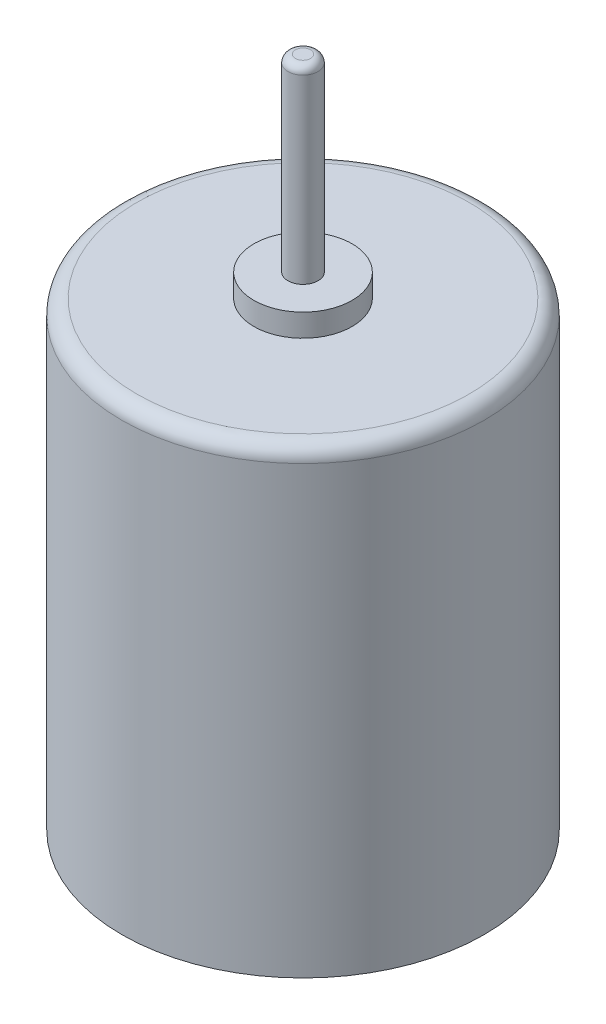
ISO-10303-21;
HEADER;
FILE_DESCRIPTION(('STEP AP214'),'2;1');
FILE_NAME('part.step','',(''),(''),'','','');
FILE_SCHEMA(('AUTOMOTIVE_DESIGN { 1 0 10303 214 1 1 1 1 }'));
ENDSEC;
DATA;
#1=APPLICATION_CONTEXT('core data for automotive mechanical design processes');
#2=APPLICATION_PROTOCOL_DEFINITION('international standard','automotive_design',2000,#1);
#3=PRODUCT_CONTEXT('',#1,'mechanical');
#4=PRODUCT('Part','Part','',(#3));
#5=PRODUCT_RELATED_PRODUCT_CATEGORY('part','',(#4));
#6=PRODUCT_DEFINITION_FORMATION('','',#4);
#7=PRODUCT_DEFINITION_CONTEXT('part definition',#1,'design');
#8=PRODUCT_DEFINITION('design','',#6,#7);
#9=PRODUCT_DEFINITION_SHAPE('','',#8);
#10=(LENGTH_UNIT() NAMED_UNIT(*) SI_UNIT(.MILLI.,.METRE.));
#11=(NAMED_UNIT(*) PLANE_ANGLE_UNIT() SI_UNIT($,.RADIAN.));
#12=(NAMED_UNIT(*) SI_UNIT($,.STERADIAN.) SOLID_ANGLE_UNIT());
#13=UNCERTAINTY_MEASURE_WITH_UNIT(LENGTH_MEASURE(1.E-05),#10,'distance_accuracy_value','');
#14=(GEOMETRIC_REPRESENTATION_CONTEXT(3) GLOBAL_UNCERTAINTY_ASSIGNED_CONTEXT((#13)) GLOBAL_UNIT_ASSIGNED_CONTEXT((#10,
#11,#12)) REPRESENTATION_CONTEXT('',''));
#15=CARTESIAN_POINT('',(0.,0.,0.));
#16=DIRECTION('',(0.,0.,1.));
#17=DIRECTION('',(1.,0.,0.));
#18=AXIS2_PLACEMENT_3D('',#15,#16,#17);
#19=CARTESIAN_POINT('',(-13.1051006987232,30.5,-2.50285866633565));
#20=DIRECTION('',(0.,-1.,0.));
#21=DIRECTION('',(0.,0.,-1.));
#22=AXIS2_PLACEMENT_3D('',#19,#20,#21);
#23=CYLINDRICAL_SURFACE('',#22,12.);
#24=CARTESIAN_POINT('',(-13.1051006987232,29.5,-2.50285866633565));
#25=DIRECTION('',(0.,1.,0.));
#26=DIRECTION('',(0.,0.,1.));
#27=AXIS2_PLACEMENT_3D('',#24,#25,#26);
#28=CIRCLE('',#27,12.);
#29=CARTESIAN_POINT('',(-13.1051006987232,29.5,-14.5028586663357));
#30=VERTEX_POINT('',#29);
#31=EDGE_CURVE('E10',#30,#30,#28,.F.);
#32=CARTESIAN_POINT('',(-13.1051006987232,0.,-2.50285866633565));
#33=DIRECTION('',(0.,1.,0.));
#34=DIRECTION('',(0.,0.,1.));
#35=AXIS2_PLACEMENT_3D('',#32,#33,#34);
#36=CIRCLE('',#35,12.);
#37=CARTESIAN_POINT('',(-13.1051006987232,0.,-14.5028586663357));
#38=VERTEX_POINT('',#37);
#39=EDGE_CURVE('E56',#38,#38,#36,.T.);
#40=CARTESIAN_POINT('',(-13.1051006987232,29.5,-14.5028586663357));
#41=CARTESIAN_POINT('',(-13.1051006987232,29.1927083333333,-14.5028586663357));
#42=CARTESIAN_POINT('',(-13.1051006987232,28.8854166666667,-14.5028586663357));
#43=CARTESIAN_POINT('',(-13.1051006987232,28.2708333333333,-14.5028586663357));
#44=CARTESIAN_POINT('',(-13.1051006987232,27.9635416666667,-14.5028586663357));
#45=CARTESIAN_POINT('',(-13.1051006987232,27.3489583333333,-14.5028586663357));
#46=CARTESIAN_POINT('',(-13.1051006987232,27.0416666666667,-14.5028586663357));
#47=CARTESIAN_POINT('',(-13.1051006987232,26.4270833333333,-14.5028586663357));
#48=CARTESIAN_POINT('',(-13.1051006987232,26.1197916666667,-14.5028586663357));
#49=CARTESIAN_POINT('',(-13.1051006987232,25.5052083333333,-14.5028586663357));
#50=CARTESIAN_POINT('',(-13.1051006987232,25.1979166666667,-14.5028586663357));
#51=CARTESIAN_POINT('',(-13.1051006987232,24.5833333333333,-14.5028586663357));
#52=CARTESIAN_POINT('',(-13.1051006987232,24.2760416666667,-14.5028586663357));
#53=CARTESIAN_POINT('',(-13.1051006987232,23.6614583333333,-14.5028586663357));
#54=CARTESIAN_POINT('',(-13.1051006987232,23.3541666666667,-14.5028586663357));
#55=CARTESIAN_POINT('',(-13.1051006987232,22.7395833333333,-14.5028586663357));
#56=CARTESIAN_POINT('',(-13.1051006987232,22.4322916666667,-14.5028586663357));
#57=CARTESIAN_POINT('',(-13.1051006987232,21.8177083333333,-14.5028586663357));
#58=CARTESIAN_POINT('',(-13.1051006987232,21.5104166666667,-14.5028586663357));
#59=CARTESIAN_POINT('',(-13.1051006987232,20.8958333333333,-14.5028586663357));
#60=CARTESIAN_POINT('',(-13.1051006987232,20.5885416666667,-14.5028586663357));
#61=CARTESIAN_POINT('',(-13.1051006987232,19.9739583333333,-14.5028586663357));
#62=CARTESIAN_POINT('',(-13.1051006987232,19.6666666666667,-14.5028586663357));
#63=CARTESIAN_POINT('',(-13.1051006987232,19.0520833333333,-14.5028586663357));
#64=CARTESIAN_POINT('',(-13.1051006987232,18.7447916666667,-14.5028586663357));
#65=CARTESIAN_POINT('',(-13.1051006987232,18.1302083333333,-14.5028586663357));
#66=CARTESIAN_POINT('',(-13.1051006987232,17.8229166666667,-14.5028586663357));
#67=CARTESIAN_POINT('',(-13.1051006987232,17.2083333333333,-14.5028586663357));
#68=CARTESIAN_POINT('',(-13.1051006987232,16.9010416666667,-14.5028586663357));
#69=CARTESIAN_POINT('',(-13.1051006987232,16.2864583333333,-14.5028586663357));
#70=CARTESIAN_POINT('',(-13.1051006987232,15.9791666666667,-14.5028586663357));
#71=CARTESIAN_POINT('',(-13.1051006987232,15.3645833333333,-14.5028586663357));
#72=CARTESIAN_POINT('',(-13.1051006987232,15.0572916666667,-14.5028586663357));
#73=CARTESIAN_POINT('',(-13.1051006987232,14.4427083333333,-14.5028586663357));
#74=CARTESIAN_POINT('',(-13.1051006987232,14.1354166666667,-14.5028586663357));
#75=CARTESIAN_POINT('',(-13.1051006987232,13.5208333333333,-14.5028586663357));
#76=CARTESIAN_POINT('',(-13.1051006987232,13.2135416666667,-14.5028586663357));
#77=CARTESIAN_POINT('',(-13.1051006987232,12.5989583333333,-14.5028586663357));
#78=CARTESIAN_POINT('',(-13.1051006987232,12.2916666666667,-14.5028586663357));
#79=CARTESIAN_POINT('',(-13.1051006987232,11.6770833333333,-14.5028586663357));
#80=CARTESIAN_POINT('',(-13.1051006987232,11.3697916666667,-14.5028586663357));
#81=CARTESIAN_POINT('',(-13.1051006987232,10.7552083333333,-14.5028586663357));
#82=CARTESIAN_POINT('',(-13.1051006987232,10.4479166666667,-14.5028586663357));
#83=CARTESIAN_POINT('',(-13.1051006987232,9.83333333333333,-14.5028586663357));
#84=CARTESIAN_POINT('',(-13.1051006987232,9.52604166666666,-14.5028586663357));
#85=CARTESIAN_POINT('',(-13.1051006987232,8.91145833333333,-14.5028586663357));
#86=CARTESIAN_POINT('',(-13.1051006987232,8.60416666666666,-14.5028586663357));
#87=CARTESIAN_POINT('',(-13.1051006987232,7.98958333333333,-14.5028586663357));
#88=CARTESIAN_POINT('',(-13.1051006987232,7.68229166666666,-14.5028586663357));
#89=CARTESIAN_POINT('',(-13.1051006987232,7.06770833333333,-14.5028586663357));
#90=CARTESIAN_POINT('',(-13.1051006987232,6.76041666666666,-14.5028586663357));
#91=CARTESIAN_POINT('',(-13.1051006987232,6.14583333333333,-14.5028586663357));
#92=CARTESIAN_POINT('',(-13.1051006987232,5.83854166666666,-14.5028586663357));
#93=CARTESIAN_POINT('',(-13.1051006987232,5.22395833333333,-14.5028586663357));
#94=CARTESIAN_POINT('',(-13.1051006987232,4.91666666666666,-14.5028586663357));
#95=CARTESIAN_POINT('',(-13.1051006987232,4.30208333333333,-14.5028586663357));
#96=CARTESIAN_POINT('',(-13.1051006987232,3.99479166666666,-14.5028586663357));
#97=CARTESIAN_POINT('',(-13.1051006987232,3.38020833333333,-14.5028586663357));
#98=CARTESIAN_POINT('',(-13.1051006987232,3.07291666666666,-14.5028586663357));
#99=CARTESIAN_POINT('',(-13.1051006987232,2.45833333333333,-14.5028586663357));
#100=CARTESIAN_POINT('',(-13.1051006987232,2.15104166666666,-14.5028586663357));
#101=CARTESIAN_POINT('',(-13.1051006987232,1.53645833333333,-14.5028586663357));
#102=CARTESIAN_POINT('',(-13.1051006987232,1.22916666666666,-14.5028586663357));
#103=CARTESIAN_POINT('',(-13.1051006987232,0.614583333333329,-14.5028586663357));
#104=CARTESIAN_POINT('',(-13.1051006987232,0.307291666666663,-14.5028586663357));
#105=CARTESIAN_POINT('',(-13.1051006987232,0.,-14.5028586663357));
#106=B_SPLINE_CURVE_WITH_KNOTS('',3,(#40,#41,#42,#43,#44,#45,#46,#47,#48,#49,#50,#51,#52,#53,
#54,#55,#56,#57,#58,#59,#60,#61,#62,#63,#64,#65,#66,#67,#68,#69,#70,#71,#72,#73,#74,#75,#76,#77,
#78,#79,#80,#81,#82,#83,#84,#85,#86,#87,#88,#89,#90,#91,#92,#93,#94,#95,#96,#97,#98,#99,#100,
#101,#102,#103,#104,#105),.UNSPECIFIED.,.F.,.F.,(4,2,2,2,2,2,2,2,2,2,2,2,2,2,2,2,2,2,2,2,2,2,2,
2,2,2,2,2,2,2,2,2,4),(0.,0.921874999999999,1.84375,2.765625,3.6875,4.609375,5.53125,6.453125,
7.375,8.296875,9.21875,10.140625,11.0625,11.984375,12.90625,13.828125,14.75,15.671875,16.59375,
17.515625,18.4375,19.359375,20.28125,21.203125,22.125,23.046875,23.96875,24.890625,25.8125,
26.734375,27.65625,28.578125,29.5),.UNSPECIFIED.);
#107=EDGE_CURVE('BSEAM36',#30,#38,#106,.T.);
#108=ORIENTED_EDGE('',*,*,#31,.T.);
#109=ORIENTED_EDGE('',*,*,#39,.T.);
#110=ORIENTED_EDGE('',*,*,#107,.T.);
#111=ORIENTED_EDGE('',*,*,#107,.F.);
#112=EDGE_LOOP('',(#108,#110,#109,#111));
#113=FACE_BOUND('',#112,.T.);
#114=ADVANCED_FACE('F36',(#113),#23,.T.);
#115=CARTESIAN_POINT('',(-13.1051006987232,30.5,-2.50285866633565));
#116=DIRECTION('',(0.,1.,0.));
#117=DIRECTION('',(0.,0.,1.));
#118=AXIS2_PLACEMENT_3D('',#115,#116,#117);
#119=PLANE('',#118);
#120=CARTESIAN_POINT('',(-13.1051006987232,30.5,-2.50285866633565));
#121=DIRECTION('',(0.,1.,0.));
#122=DIRECTION('',(0.,0.,1.));
#123=AXIS2_PLACEMENT_3D('',#120,#121,#122);
#124=CIRCLE('',#123,11.);
#125=CARTESIAN_POINT('',(-13.1051006987232,30.5,8.49714133366435));
#126=VERTEX_POINT('',#125);
#127=EDGE_CURVE('E43',#126,#126,#124,.T.);
#128=ORIENTED_EDGE('',*,*,#127,.T.);
#129=EDGE_LOOP('',(#128));
#130=FACE_BOUND('',#129,.T.);
#131=CARTESIAN_POINT('',(-13.1051006987232,30.5,-2.50285866633565));
#132=DIRECTION('',(0.,1.,0.));
#133=DIRECTION('',(0.,0.,1.));
#134=AXIS2_PLACEMENT_3D('',#131,#132,#133);
#135=CIRCLE('',#134,3.25);
#136=CARTESIAN_POINT('',(-13.1051006987232,30.5,0.747141333664346));
#137=VERTEX_POINT('',#136);
#138=EDGE_CURVE('E59',#137,#137,#135,.F.);
#139=ORIENTED_EDGE('',*,*,#138,.T.);
#140=EDGE_LOOP('',(#139));
#141=FACE_BOUND('',#140,.T.);
#142=ADVANCED_FACE('F85',(#130,#141),#119,.T.);
#143=CARTESIAN_POINT('',(-13.1051006987232,0.,-2.50285866633565));
#144=DIRECTION('',(0.,1.,0.));
#145=DIRECTION('',(0.,0.,1.));
#146=AXIS2_PLACEMENT_3D('',#143,#144,#145);
#147=PLANE('',#146);
#148=ORIENTED_EDGE('',*,*,#39,.F.);
#149=EDGE_LOOP('',(#148));
#150=FACE_BOUND('',#149,.T.);
#151=ADVANCED_FACE('F79',(#150),#147,.F.);
#152=CARTESIAN_POINT('',(-13.1051006987232,32.,-2.50285866633565));
#153=DIRECTION('',(0.,-1.,0.));
#154=DIRECTION('',(0.,0.,-1.));
#155=AXIS2_PLACEMENT_3D('',#152,#153,#154);
#156=CYLINDRICAL_SURFACE('',#155,3.25);
#157=ORIENTED_EDGE('',*,*,#138,.F.);
#158=EDGE_LOOP('',(#157));
#159=FACE_BOUND('',#158,.T.);
#160=CARTESIAN_POINT('',(-13.1051006987232,32.,-2.50285866633565));
#161=DIRECTION('',(0.,1.,0.));
#162=DIRECTION('',(0.,0.,1.));
#163=AXIS2_PLACEMENT_3D('',#160,#161,#162);
#164=CIRCLE('',#163,3.25);
#165=CARTESIAN_POINT('',(-13.1051006987232,32.,0.747141333664346));
#166=VERTEX_POINT('',#165);
#167=EDGE_CURVE('E62',#166,#166,#164,.T.);
#168=ORIENTED_EDGE('',*,*,#167,.F.);
#169=EDGE_LOOP('',(#168));
#170=FACE_BOUND('',#169,.T.);
#171=ADVANCED_FACE('F74',(#159,#170),#156,.T.);
#172=CARTESIAN_POINT('',(0.,32.,0.));
#173=DIRECTION('',(0.,1.,0.));
#174=DIRECTION('',(0.,0.,1.));
#175=AXIS2_PLACEMENT_3D('',#172,#173,#174);
#176=PLANE('',#175);
#177=CARTESIAN_POINT('',(-13.1051006987232,32.,-2.50285866633565));
#178=DIRECTION('',(0.,1.,0.));
#179=DIRECTION('',(0.,0.,1.));
#180=AXIS2_PLACEMENT_3D('',#177,#178,#179);
#181=CIRCLE('',#180,1.);
#182=CARTESIAN_POINT('',(-13.1051006987232,32.,-1.50285866633565));
#183=VERTEX_POINT('',#182);
#184=EDGE_CURVE('E65',#183,#183,#181,.T.);
#185=ORIENTED_EDGE('',*,*,#184,.F.);
#186=EDGE_LOOP('',(#185));
#187=FACE_BOUND('',#186,.T.);
#188=ORIENTED_EDGE('',*,*,#167,.T.);
#189=EDGE_LOOP('',(#188));
#190=FACE_BOUND('',#189,.T.);
#191=ADVANCED_FACE('F71',(#187,#190),#176,.T.);
#192=CARTESIAN_POINT('',(-13.1051006987232,44.5,-2.50285866633565));
#193=DIRECTION('',(0.,-1.,0.));
#194=DIRECTION('',(0.,0.,-1.));
#195=AXIS2_PLACEMENT_3D('',#192,#193,#194);
#196=CYLINDRICAL_SURFACE('',#195,1.);
#197=CARTESIAN_POINT('',(-13.1051006987232,44.,-2.50285866633565));
#198=DIRECTION('',(0.,1.,0.));
#199=DIRECTION('',(0.,0.,1.));
#200=AXIS2_PLACEMENT_3D('',#197,#198,#199);
#201=CIRCLE('',#200,1.);
#202=CARTESIAN_POINT('',(-13.1051006987232,44.,-1.50285866633565));
#203=VERTEX_POINT('',#202);
#204=EDGE_CURVE('E47',#203,#203,#201,.F.);
#205=ORIENTED_EDGE('',*,*,#204,.T.);
#206=EDGE_LOOP('',(#205));
#207=FACE_BOUND('',#206,.T.);
#208=ORIENTED_EDGE('',*,*,#184,.T.);
#209=EDGE_LOOP('',(#208));
#210=FACE_BOUND('',#209,.T.);
#211=ADVANCED_FACE('F69',(#207,#210),#196,.T.);
#212=CARTESIAN_POINT('',(-13.1051006987232,44.5,-2.50285866633565));
#213=DIRECTION('',(0.,1.,0.));
#214=DIRECTION('',(0.,0.,1.));
#215=AXIS2_PLACEMENT_3D('',#212,#213,#214);
#216=PLANE('',#215);
#217=CARTESIAN_POINT('',(-13.1051006987232,44.5,-2.50285866633565));
#218=DIRECTION('',(0.,1.,0.));
#219=DIRECTION('',(0.,0.,1.));
#220=AXIS2_PLACEMENT_3D('',#217,#218,#219);
#221=CIRCLE('',#220,0.500000000000002);
#222=CARTESIAN_POINT('',(-13.1051006987232,44.5,-2.00285866633565));
#223=VERTEX_POINT('',#222);
#224=EDGE_CURVE('E51',#223,#223,#221,.T.);
#225=ORIENTED_EDGE('',*,*,#224,.T.);
#226=EDGE_LOOP('',(#225));
#227=FACE_BOUND('',#226,.T.);
#228=ADVANCED_FACE('F98',(#227),#216,.T.);
#229=CARTESIAN_POINT('',(-13.1051006987232,44.,-2.50285866633565));
#230=DIRECTION('',(0.,1.,0.));
#231=DIRECTION('',(0.,0.,1.));
#232=AXIS2_PLACEMENT_3D('',#229,#230,#231);
#233=TOROIDAL_SURFACE('',#232,0.500000000000002,0.5);
#234=ORIENTED_EDGE('',*,*,#204,.F.);
#235=EDGE_LOOP('',(#234));
#236=FACE_BOUND('',#235,.T.);
#237=ORIENTED_EDGE('',*,*,#224,.F.);
#238=EDGE_LOOP('',(#237));
#239=FACE_BOUND('',#238,.T.);
#240=ADVANCED_FACE('F96',(#236,#239),#233,.T.);
#241=CARTESIAN_POINT('',(-13.1051006987232,29.5,-2.50285866633565));
#242=DIRECTION('',(0.,1.,0.));
#243=DIRECTION('',(0.,0.,1.));
#244=AXIS2_PLACEMENT_3D('',#241,#242,#243);
#245=TOROIDAL_SURFACE('',#244,11.,1.);
#246=ORIENTED_EDGE('',*,*,#31,.F.);
#247=EDGE_LOOP('',(#246));
#248=FACE_BOUND('',#247,.T.);
#249=ORIENTED_EDGE('',*,*,#127,.F.);
#250=EDGE_LOOP('',(#249));
#251=FACE_BOUND('',#250,.T.);
#252=ADVANCED_FACE('F38',(#248,#251),#245,.T.);
#253=CLOSED_SHELL('',(#114,#142,#151,#171,#191,#211,#228,#240,#252));
#254=MANIFOLD_SOLID_BREP('B2',#253);
#255=ADVANCED_BREP_SHAPE_REPRESENTATION('',(#18,#254),#14);
#256=SHAPE_DEFINITION_REPRESENTATION(#9,#255);
ENDSEC;
END-ISO-10303-21;
